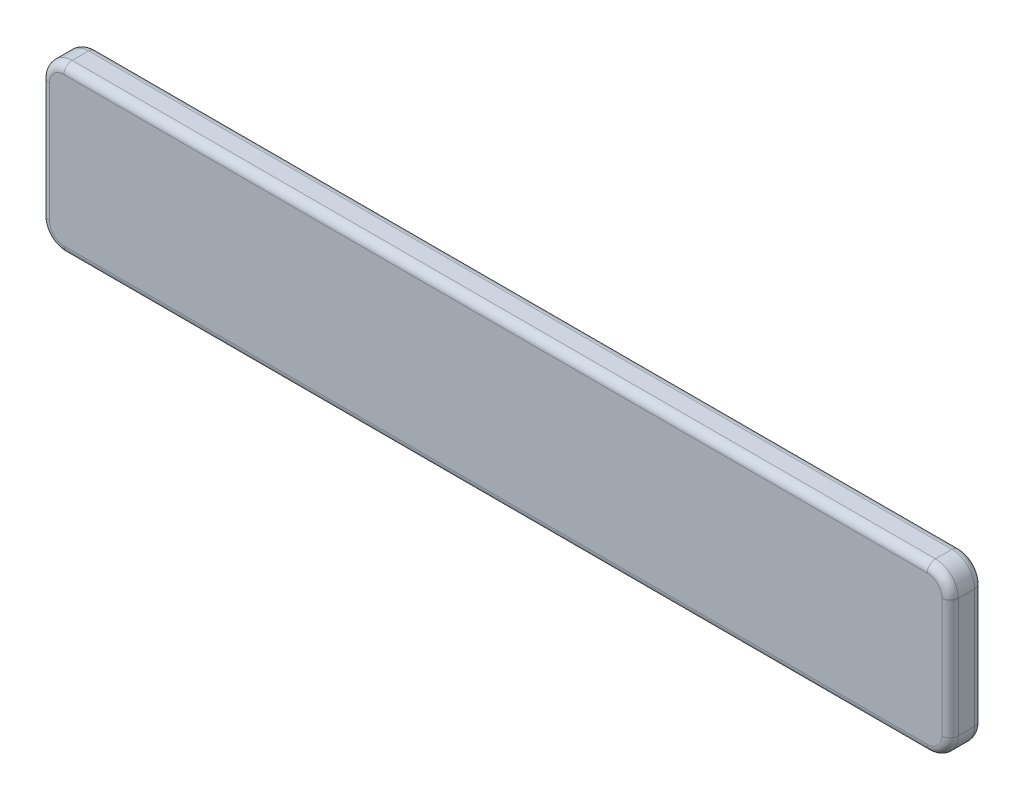
ISO-10303-21;
HEADER;
FILE_DESCRIPTION(('STEP AP214'),'2;1');
FILE_NAME('part.step','',(''),(''),'','','');
FILE_SCHEMA(('AUTOMOTIVE_DESIGN { 1 0 10303 214 1 1 1 1 }'));
ENDSEC;
DATA;
#1=APPLICATION_CONTEXT('core data for automotive mechanical design processes');
#2=APPLICATION_PROTOCOL_DEFINITION('international standard','automotive_design',2000,#1);
#3=PRODUCT_CONTEXT('',#1,'mechanical');
#4=PRODUCT('Part','Part','',(#3));
#5=PRODUCT_RELATED_PRODUCT_CATEGORY('part','',(#4));
#6=PRODUCT_DEFINITION_FORMATION('','',#4);
#7=PRODUCT_DEFINITION_CONTEXT('part definition',#1,'design');
#8=PRODUCT_DEFINITION('design','',#6,#7);
#9=PRODUCT_DEFINITION_SHAPE('','',#8);
#10=(LENGTH_UNIT() NAMED_UNIT(*) SI_UNIT(.MILLI.,.METRE.));
#11=(NAMED_UNIT(*) PLANE_ANGLE_UNIT() SI_UNIT($,.RADIAN.));
#12=(NAMED_UNIT(*) SI_UNIT($,.STERADIAN.) SOLID_ANGLE_UNIT());
#13=UNCERTAINTY_MEASURE_WITH_UNIT(LENGTH_MEASURE(1.E-05),#10,'distance_accuracy_value','');
#14=(GEOMETRIC_REPRESENTATION_CONTEXT(3) GLOBAL_UNCERTAINTY_ASSIGNED_CONTEXT((#13)) GLOBAL_UNIT_ASSIGNED_CONTEXT((#10,
#11,#12)) REPRESENTATION_CONTEXT('',''));
#15=CARTESIAN_POINT('',(0.,0.,0.));
#16=DIRECTION('',(0.,0.,1.));
#17=DIRECTION('',(1.,0.,0.));
#18=AXIS2_PLACEMENT_3D('',#15,#16,#17);
#19=CARTESIAN_POINT('',(167.513,-48.7426,12.7));
#20=DIRECTION('',(0.,0.,-1.));
#21=DIRECTION('',(-1.,0.,0.));
#22=AXIS2_PLACEMENT_3D('',#19,#20,#21);
#23=CYLINDRICAL_SURFACE('',#22,8.8392);
#24=DIRECTION('',(0.,0.,-1.));
#25=VECTOR('',#24,1.);
#26=CARTESIAN_POINT('',(167.513,-57.5818,12.7));
#27=LINE('',#26,#25);
#28=CARTESIAN_POINT('',(167.513,-57.5818,9.525));
#29=VERTEX_POINT('',#28);
#30=CARTESIAN_POINT('',(167.513,-57.5818,3.175));
#31=VERTEX_POINT('',#30);
#32=EDGE_CURVE('E174',#29,#31,#27,.T.);
#33=ORIENTED_EDGE('',*,*,#32,.T.);
#34=CARTESIAN_POINT('',(167.513,-48.7426,3.175));
#35=DIRECTION('',(0.,0.,1.));
#36=DIRECTION('',(1.,0.,0.));
#37=AXIS2_PLACEMENT_3D('',#34,#35,#36);
#38=CIRCLE('',#37,8.8392);
#39=CARTESIAN_POINT('',(176.3522,-48.7426,3.175));
#40=VERTEX_POINT('',#39);
#41=EDGE_CURVE('E250',#31,#40,#38,.T.);
#42=ORIENTED_EDGE('',*,*,#41,.T.);
#43=DIRECTION('',(0.,0.,-1.));
#44=VECTOR('',#43,1.);
#45=CARTESIAN_POINT('',(176.3522,-48.7426,12.7));
#46=LINE('',#45,#44);
#47=CARTESIAN_POINT('',(176.3522,-48.7426,9.525));
#48=VERTEX_POINT('',#47);
#49=EDGE_CURVE('E177',#48,#40,#46,.T.);
#50=ORIENTED_EDGE('',*,*,#49,.F.);
#51=CARTESIAN_POINT('',(167.513,-48.7426,9.525));
#52=DIRECTION('',(0.,0.,1.));
#53=DIRECTION('',(1.,0.,0.));
#54=AXIS2_PLACEMENT_3D('',#51,#52,#53);
#55=CIRCLE('',#54,8.8392);
#56=EDGE_CURVE('E201',#48,#29,#55,.F.);
#57=ORIENTED_EDGE('',*,*,#56,.T.);
#58=EDGE_LOOP('',(#33,#42,#50,#57));
#59=FACE_BOUND('',#58,.T.);
#60=ADVANCED_FACE('F33',(#59),#23,.T.);
#61=CARTESIAN_POINT('',(176.3522,-2.48920000000002,12.7));
#62=DIRECTION('',(1.,0.,0.));
#63=DIRECTION('',(0.,1.,0.));
#64=AXIS2_PLACEMENT_3D('',#61,#62,#63);
#65=PLANE('',#64);
#66=ORIENTED_EDGE('',*,*,#49,.T.);
#67=DIRECTION('',(0.,-1.,0.));
#68=VECTOR('',#67,1.);
#69=CARTESIAN_POINT('',(176.3522,-2.48920000000002,3.175));
#70=LINE('',#69,#68);
#71=CARTESIAN_POINT('',(176.3522,-2.48920000000002,3.175));
#72=VERTEX_POINT('',#71);
#73=EDGE_CURVE('E57',#40,#72,#70,.F.);
#74=ORIENTED_EDGE('',*,*,#73,.T.);
#75=DIRECTION('',(0.,0.,-1.));
#76=VECTOR('',#75,1.);
#77=CARTESIAN_POINT('',(176.3522,-2.48920000000002,12.7));
#78=LINE('',#77,#76);
#79=CARTESIAN_POINT('',(176.3522,-2.48920000000002,9.525));
#80=VERTEX_POINT('',#79);
#81=EDGE_CURVE('E310',#80,#72,#78,.T.);
#82=ORIENTED_EDGE('',*,*,#81,.F.);
#83=DIRECTION('',(0.,-1.,0.));
#84=VECTOR('',#83,1.);
#85=CARTESIAN_POINT('',(176.3522,-2.48920000000002,9.525));
#86=LINE('',#85,#84);
#87=EDGE_CURVE('E203',#80,#48,#86,.T.);
#88=ORIENTED_EDGE('',*,*,#87,.T.);
#89=EDGE_LOOP('',(#66,#74,#82,#88));
#90=FACE_BOUND('',#89,.T.);
#91=ADVANCED_FACE('F317',(#90),#65,.T.);
#92=CARTESIAN_POINT('',(167.513,-2.48920000000008,12.7));
#93=DIRECTION('',(0.,0.,-1.));
#94=DIRECTION('',(-1.,0.,0.));
#95=AXIS2_PLACEMENT_3D('',#92,#93,#94);
#96=CYLINDRICAL_SURFACE('',#95,8.83920000000001);
#97=ORIENTED_EDGE('',*,*,#81,.T.);
#98=CARTESIAN_POINT('',(167.513,-2.48920000000008,3.175));
#99=DIRECTION('',(0.,0.,1.));
#100=DIRECTION('',(1.,0.,0.));
#101=AXIS2_PLACEMENT_3D('',#98,#99,#100);
#102=CIRCLE('',#101,8.83920000000001);
#103=CARTESIAN_POINT('',(167.513,6.34999999999993,3.175));
#104=VERTEX_POINT('',#103);
#105=EDGE_CURVE('E42',#72,#104,#102,.T.);
#106=ORIENTED_EDGE('',*,*,#105,.T.);
#107=DIRECTION('',(0.,0.,-1.));
#108=VECTOR('',#107,1.);
#109=CARTESIAN_POINT('',(167.513,6.34999999999993,12.7));
#110=LINE('',#109,#108);
#111=CARTESIAN_POINT('',(167.513,6.34999999999993,9.525));
#112=VERTEX_POINT('',#111);
#113=EDGE_CURVE('E302',#112,#104,#110,.T.);
#114=ORIENTED_EDGE('',*,*,#113,.F.);
#115=CARTESIAN_POINT('',(167.513,-2.48920000000008,9.525));
#116=DIRECTION('',(0.,0.,1.));
#117=DIRECTION('',(1.,0.,0.));
#118=AXIS2_PLACEMENT_3D('',#115,#116,#117);
#119=CIRCLE('',#118,8.83920000000001);
#120=EDGE_CURVE('E165',#112,#80,#119,.F.);
#121=ORIENTED_EDGE('',*,*,#120,.T.);
#122=EDGE_LOOP('',(#97,#106,#114,#121));
#123=FACE_BOUND('',#122,.T.);
#124=ADVANCED_FACE('F345',(#123),#96,.T.);
#125=CARTESIAN_POINT('',(-167.513,6.35,12.7));
#126=DIRECTION('',(0.,1.,0.));
#127=DIRECTION('',(-1.,0.,0.));
#128=AXIS2_PLACEMENT_3D('',#125,#126,#127);
#129=PLANE('',#128);
#130=ORIENTED_EDGE('',*,*,#113,.T.);
#131=DIRECTION('',(1.,0.,0.));
#132=VECTOR('',#131,1.);
#133=CARTESIAN_POINT('',(-167.513,6.35,3.175));
#134=LINE('',#133,#132);
#135=CARTESIAN_POINT('',(-167.513,6.34999999999999,3.175));
#136=VERTEX_POINT('',#135);
#137=EDGE_CURVE('E11',#104,#136,#134,.F.);
#138=ORIENTED_EDGE('',*,*,#137,.T.);
#139=DIRECTION('',(0.,0.,-1.));
#140=VECTOR('',#139,1.);
#141=CARTESIAN_POINT('',(-167.513,6.34999999999999,12.7));
#142=LINE('',#141,#140);
#143=CARTESIAN_POINT('',(-167.513,6.34999999999999,9.525));
#144=VERTEX_POINT('',#143);
#145=EDGE_CURVE('E301',#144,#136,#142,.T.);
#146=ORIENTED_EDGE('',*,*,#145,.F.);
#147=DIRECTION('',(1.,0.,0.));
#148=VECTOR('',#147,1.);
#149=CARTESIAN_POINT('',(-167.513,6.35,9.525));
#150=LINE('',#149,#148);
#151=EDGE_CURVE('E206',#144,#112,#150,.T.);
#152=ORIENTED_EDGE('',*,*,#151,.T.);
#153=EDGE_LOOP('',(#130,#138,#146,#152));
#154=FACE_BOUND('',#153,.T.);
#155=ADVANCED_FACE('F300',(#154),#129,.T.);
#156=CARTESIAN_POINT('',(-167.513,-2.48919999999998,12.7));
#157=DIRECTION('',(0.,0.,-1.));
#158=DIRECTION('',(-1.,0.,0.));
#159=AXIS2_PLACEMENT_3D('',#156,#157,#158);
#160=CYLINDRICAL_SURFACE('',#159,8.83919999999997);
#161=ORIENTED_EDGE('',*,*,#145,.T.);
#162=CARTESIAN_POINT('',(-167.513,-2.48919999999998,3.175));
#163=DIRECTION('',(0.,0.,1.));
#164=DIRECTION('',(1.,0.,0.));
#165=AXIS2_PLACEMENT_3D('',#162,#163,#164);
#166=CIRCLE('',#165,8.83919999999997);
#167=CARTESIAN_POINT('',(-176.3522,-2.48919999999995,3.175));
#168=VERTEX_POINT('',#167);
#169=EDGE_CURVE('E208',#136,#168,#166,.T.);
#170=ORIENTED_EDGE('',*,*,#169,.T.);
#171=DIRECTION('',(0.,0.,-1.));
#172=VECTOR('',#171,1.);
#173=CARTESIAN_POINT('',(-176.3522,-2.48919999999995,12.7));
#174=LINE('',#173,#172);
#175=CARTESIAN_POINT('',(-176.3522,-2.48919999999995,9.525));
#176=VERTEX_POINT('',#175);
#177=EDGE_CURVE('E308',#176,#168,#174,.T.);
#178=ORIENTED_EDGE('',*,*,#177,.F.);
#179=CARTESIAN_POINT('',(-167.513,-2.48919999999998,9.525));
#180=DIRECTION('',(0.,0.,1.));
#181=DIRECTION('',(1.,0.,0.));
#182=AXIS2_PLACEMENT_3D('',#179,#180,#181);
#183=CIRCLE('',#182,8.83919999999997);
#184=EDGE_CURVE('E192',#176,#144,#183,.F.);
#185=ORIENTED_EDGE('',*,*,#184,.T.);
#186=EDGE_LOOP('',(#161,#170,#178,#185));
#187=FACE_BOUND('',#186,.T.);
#188=ADVANCED_FACE('F304',(#187),#160,.T.);
#189=CARTESIAN_POINT('',(-176.3522,-48.7426,12.7));
#190=DIRECTION('',(-1.,0.,0.));
#191=DIRECTION('',(0.,-1.,0.));
#192=AXIS2_PLACEMENT_3D('',#189,#190,#191);
#193=PLANE('',#192);
#194=ORIENTED_EDGE('',*,*,#177,.T.);
#195=DIRECTION('',(0.,1.,0.));
#196=VECTOR('',#195,1.);
#197=CARTESIAN_POINT('',(-176.3522,-48.7426,3.175));
#198=LINE('',#197,#196);
#199=CARTESIAN_POINT('',(-176.3522,-48.7426,3.175));
#200=VERTEX_POINT('',#199);
#201=EDGE_CURVE('E244',#168,#200,#198,.F.);
#202=ORIENTED_EDGE('',*,*,#201,.T.);
#203=DIRECTION('',(0.,0.,-1.));
#204=VECTOR('',#203,1.);
#205=CARTESIAN_POINT('',(-176.3522,-48.7426,12.7));
#206=LINE('',#205,#204);
#207=CARTESIAN_POINT('',(-176.3522,-48.7426,9.525));
#208=VERTEX_POINT('',#207);
#209=EDGE_CURVE('E312',#208,#200,#206,.T.);
#210=ORIENTED_EDGE('',*,*,#209,.F.);
#211=DIRECTION('',(0.,1.,0.));
#212=VECTOR('',#211,1.);
#213=CARTESIAN_POINT('',(-176.3522,-48.7426,9.525));
#214=LINE('',#213,#212);
#215=EDGE_CURVE('E195',#208,#176,#214,.T.);
#216=ORIENTED_EDGE('',*,*,#215,.T.);
#217=EDGE_LOOP('',(#194,#202,#210,#216));
#218=FACE_BOUND('',#217,.T.);
#219=ADVANCED_FACE('F512',(#218),#193,.T.);
#220=CARTESIAN_POINT('',(-167.513,-48.7426,12.7));
#221=DIRECTION('',(0.,0.,-1.));
#222=DIRECTION('',(-1.,0.,0.));
#223=AXIS2_PLACEMENT_3D('',#220,#221,#222);
#224=CYLINDRICAL_SURFACE('',#223,8.83919999999998);
#225=ORIENTED_EDGE('',*,*,#209,.T.);
#226=CARTESIAN_POINT('',(-167.513,-48.7426,3.175));
#227=DIRECTION('',(0.,0.,1.));
#228=DIRECTION('',(1.,0.,0.));
#229=AXIS2_PLACEMENT_3D('',#226,#227,#228);
#230=CIRCLE('',#229,8.83919999999998);
#231=CARTESIAN_POINT('',(-167.513,-57.5818,3.175));
#232=VERTEX_POINT('',#231);
#233=EDGE_CURVE('E246',#200,#232,#230,.T.);
#234=ORIENTED_EDGE('',*,*,#233,.T.);
#235=DIRECTION('',(0.,0.,-1.));
#236=VECTOR('',#235,1.);
#237=CARTESIAN_POINT('',(-167.513,-57.5818,12.7));
#238=LINE('',#237,#236);
#239=CARTESIAN_POINT('',(-167.513,-57.5818,9.525));
#240=VERTEX_POINT('',#239);
#241=EDGE_CURVE('E224',#240,#232,#238,.T.);
#242=ORIENTED_EDGE('',*,*,#241,.F.);
#243=CARTESIAN_POINT('',(-167.513,-48.7426,9.525));
#244=DIRECTION('',(0.,0.,1.));
#245=DIRECTION('',(1.,0.,0.));
#246=AXIS2_PLACEMENT_3D('',#243,#244,#245);
#247=CIRCLE('',#246,8.83919999999998);
#248=EDGE_CURVE('E197',#240,#208,#247,.F.);
#249=ORIENTED_EDGE('',*,*,#248,.T.);
#250=EDGE_LOOP('',(#225,#234,#242,#249));
#251=FACE_BOUND('',#250,.T.);
#252=ADVANCED_FACE('F499',(#251),#224,.T.);
#253=CARTESIAN_POINT('',(-157.3022,-57.5818000000001,12.7));
#254=DIRECTION('',(0.,-1.,0.));
#255=DIRECTION('',(1.,0.,0.));
#256=AXIS2_PLACEMENT_3D('',#253,#254,#255);
#257=PLANE('',#256);
#258=ORIENTED_EDGE('',*,*,#241,.T.);
#259=DIRECTION('',(-1.,0.,0.));
#260=VECTOR('',#259,1.);
#261=CARTESIAN_POINT('',(167.513,-57.5818000000027,3.175));
#262=LINE('',#261,#260);
#263=EDGE_CURVE('E248',#232,#31,#262,.F.);
#264=ORIENTED_EDGE('',*,*,#263,.T.);
#265=ORIENTED_EDGE('',*,*,#32,.F.);
#266=DIRECTION('',(1.,0.,0.));
#267=VECTOR('',#266,1.);
#268=CARTESIAN_POINT('',(-157.3022,-57.5818000000001,9.525));
#269=LINE('',#268,#267);
#270=EDGE_CURVE('E199',#29,#240,#269,.F.);
#271=ORIENTED_EDGE('',*,*,#270,.T.);
#272=EDGE_LOOP('',(#258,#264,#265,#271));
#273=FACE_BOUND('',#272,.T.);
#274=ADVANCED_FACE('F492',(#273),#257,.T.);
#275=CARTESIAN_POINT('',(167.513,-48.7426,12.7));
#276=DIRECTION('',(0.,0.,1.));
#277=DIRECTION('',(1.,0.,0.));
#278=AXIS2_PLACEMENT_3D('',#275,#276,#277);
#279=PLANE('',#278);
#280=DIRECTION('',(1.,0.,0.));
#281=VECTOR('',#280,1.);
#282=CARTESIAN_POINT('',(167.513,3.17499999999993,12.7));
#283=LINE('',#282,#281);
#284=CARTESIAN_POINT('',(167.513,3.17499999999993,12.7));
#285=VERTEX_POINT('',#284);
#286=CARTESIAN_POINT('',(-167.513,3.175,12.7));
#287=VERTEX_POINT('',#286);
#288=EDGE_CURVE('E153',#285,#287,#283,.F.);
#289=ORIENTED_EDGE('',*,*,#288,.T.);
#290=CARTESIAN_POINT('',(-167.513,-2.48919999999998,12.7));
#291=DIRECTION('',(0.,0.,1.));
#292=DIRECTION('',(1.,0.,0.));
#293=AXIS2_PLACEMENT_3D('',#290,#291,#292);
#294=CIRCLE('',#293,5.66419999999997);
#295=CARTESIAN_POINT('',(-173.1772,-2.48919999999996,12.7));
#296=VERTEX_POINT('',#295);
#297=EDGE_CURVE('E190',#287,#296,#294,.T.);
#298=ORIENTED_EDGE('',*,*,#297,.T.);
#299=DIRECTION('',(0.,1.,0.));
#300=VECTOR('',#299,1.);
#301=CARTESIAN_POINT('',(-173.1772,-48.7425999999988,12.7));
#302=LINE('',#301,#300);
#303=CARTESIAN_POINT('',(-173.1772,-48.7426,12.7));
#304=VERTEX_POINT('',#303);
#305=EDGE_CURVE('E188',#296,#304,#302,.F.);
#306=ORIENTED_EDGE('',*,*,#305,.T.);
#307=CARTESIAN_POINT('',(-167.513,-48.7426,12.7));
#308=DIRECTION('',(0.,0.,1.));
#309=DIRECTION('',(1.,0.,0.));
#310=AXIS2_PLACEMENT_3D('',#307,#308,#309);
#311=CIRCLE('',#310,5.66419999999998);
#312=CARTESIAN_POINT('',(-167.513,-54.4068,12.7));
#313=VERTEX_POINT('',#312);
#314=EDGE_CURVE('E186',#304,#313,#311,.T.);
#315=ORIENTED_EDGE('',*,*,#314,.T.);
#316=DIRECTION('',(1.,0.,0.));
#317=VECTOR('',#316,1.);
#318=CARTESIAN_POINT('',(167.513,-54.4068000000027,12.7));
#319=LINE('',#318,#317);
#320=CARTESIAN_POINT('',(167.513,-54.4068,12.7));
#321=VERTEX_POINT('',#320);
#322=EDGE_CURVE('E184',#313,#321,#319,.T.);
#323=ORIENTED_EDGE('',*,*,#322,.T.);
#324=CARTESIAN_POINT('',(167.513,-48.7426,12.7));
#325=DIRECTION('',(0.,0.,1.));
#326=DIRECTION('',(1.,0.,0.));
#327=AXIS2_PLACEMENT_3D('',#324,#325,#326);
#328=CIRCLE('',#327,5.6642);
#329=CARTESIAN_POINT('',(173.1772,-48.7426,12.7));
#330=VERTEX_POINT('',#329);
#331=EDGE_CURVE('E182',#321,#330,#328,.T.);
#332=ORIENTED_EDGE('',*,*,#331,.T.);
#333=DIRECTION('',(0.,-1.,0.));
#334=VECTOR('',#333,1.);
#335=CARTESIAN_POINT('',(173.1772,-48.7426,12.7));
#336=LINE('',#335,#334);
#337=CARTESIAN_POINT('',(173.1772,-2.48920000000003,12.7));
#338=VERTEX_POINT('',#337);
#339=EDGE_CURVE('E156',#330,#338,#336,.F.);
#340=ORIENTED_EDGE('',*,*,#339,.T.);
#341=CARTESIAN_POINT('',(167.513,-2.48920000000008,12.7));
#342=DIRECTION('',(0.,0.,1.));
#343=DIRECTION('',(1.,0.,0.));
#344=AXIS2_PLACEMENT_3D('',#341,#342,#343);
#345=CIRCLE('',#344,5.66420000000001);
#346=EDGE_CURVE('E148',#338,#285,#345,.T.);
#347=ORIENTED_EDGE('',*,*,#346,.T.);
#348=EDGE_LOOP('',(#289,#298,#306,#315,#323,#332,#340,#347));
#349=FACE_BOUND('',#348,.T.);
#350=ADVANCED_FACE('F150',(#349),#279,.T.);
#351=CARTESIAN_POINT('',(167.513,-48.7426,0.));
#352=DIRECTION('',(0.,0.,1.));
#353=DIRECTION('',(1.,0.,0.));
#354=AXIS2_PLACEMENT_3D('',#351,#352,#353);
#355=PLANE('',#354);
#356=DIRECTION('',(0.,1.,0.));
#357=VECTOR('',#356,1.);
#358=CARTESIAN_POINT('',(-173.1772,-2.48919999999996,0.));
#359=LINE('',#358,#357);
#360=CARTESIAN_POINT('',(-173.1772,-48.7426,0.));
#361=VERTEX_POINT('',#360);
#362=CARTESIAN_POINT('',(-173.1772,-2.48919999999996,0.));
#363=VERTEX_POINT('',#362);
#364=EDGE_CURVE('E239',#361,#363,#359,.T.);
#365=ORIENTED_EDGE('',*,*,#364,.T.);
#366=CARTESIAN_POINT('',(-167.513,-2.48919999999998,0.));
#367=DIRECTION('',(0.,0.,1.));
#368=DIRECTION('',(1.,0.,0.));
#369=AXIS2_PLACEMENT_3D('',#366,#367,#368);
#370=CIRCLE('',#369,5.66419999999997);
#371=CARTESIAN_POINT('',(-167.513,3.17499999999999,0.));
#372=VERTEX_POINT('',#371);
#373=EDGE_CURVE('E241',#363,#372,#370,.F.);
#374=ORIENTED_EDGE('',*,*,#373,.T.);
#375=DIRECTION('',(1.,0.,0.));
#376=VECTOR('',#375,1.);
#377=CARTESIAN_POINT('',(167.513,3.17499999999993,0.));
#378=LINE('',#377,#376);
#379=CARTESIAN_POINT('',(167.513,3.17499999999993,0.));
#380=VERTEX_POINT('',#379);
#381=EDGE_CURVE('E227',#372,#380,#378,.T.);
#382=ORIENTED_EDGE('',*,*,#381,.T.);
#383=CARTESIAN_POINT('',(167.513,-2.48920000000008,0.));
#384=DIRECTION('',(0.,0.,1.));
#385=DIRECTION('',(1.,0.,0.));
#386=AXIS2_PLACEMENT_3D('',#383,#384,#385);
#387=CIRCLE('',#386,5.66420000000001);
#388=CARTESIAN_POINT('',(173.1772,-2.48920000000003,0.));
#389=VERTEX_POINT('',#388);
#390=EDGE_CURVE('E229',#380,#389,#387,.F.);
#391=ORIENTED_EDGE('',*,*,#390,.T.);
#392=DIRECTION('',(0.,-1.,0.));
#393=VECTOR('',#392,1.);
#394=CARTESIAN_POINT('',(173.1772,-48.7426,0.));
#395=LINE('',#394,#393);
#396=CARTESIAN_POINT('',(173.1772,-48.7426,0.));
#397=VERTEX_POINT('',#396);
#398=EDGE_CURVE('E231',#389,#397,#395,.T.);
#399=ORIENTED_EDGE('',*,*,#398,.T.);
#400=CARTESIAN_POINT('',(167.513,-48.7426,0.));
#401=DIRECTION('',(0.,0.,1.));
#402=DIRECTION('',(1.,0.,0.));
#403=AXIS2_PLACEMENT_3D('',#400,#401,#402);
#404=CIRCLE('',#403,5.6642);
#405=CARTESIAN_POINT('',(167.513,-54.4068,0.));
#406=VERTEX_POINT('',#405);
#407=EDGE_CURVE('E233',#397,#406,#404,.F.);
#408=ORIENTED_EDGE('',*,*,#407,.T.);
#409=DIRECTION('',(-1.,0.,0.));
#410=VECTOR('',#409,1.);
#411=CARTESIAN_POINT('',(-167.513,-54.4068,0.));
#412=LINE('',#411,#410);
#413=CARTESIAN_POINT('',(-167.513,-54.4068,0.));
#414=VERTEX_POINT('',#413);
#415=EDGE_CURVE('E235',#406,#414,#412,.T.);
#416=ORIENTED_EDGE('',*,*,#415,.T.);
#417=CARTESIAN_POINT('',(-167.513,-48.7426,0.));
#418=DIRECTION('',(0.,0.,1.));
#419=DIRECTION('',(1.,0.,0.));
#420=AXIS2_PLACEMENT_3D('',#417,#418,#419);
#421=CIRCLE('',#420,5.66419999999998);
#422=EDGE_CURVE('E237',#414,#361,#421,.F.);
#423=ORIENTED_EDGE('',*,*,#422,.T.);
#424=EDGE_LOOP('',(#365,#374,#382,#391,#399,#408,#416,#423));
#425=FACE_BOUND('',#424,.T.);
#426=ADVANCED_FACE('F285',(#425),#355,.F.);
#427=CARTESIAN_POINT('',(167.513,-48.7426,9.525));
#428=DIRECTION('',(0.,0.,1.));
#429=DIRECTION('',(1.,0.,0.));
#430=AXIS2_PLACEMENT_3D('',#427,#428,#429);
#431=TOROIDAL_SURFACE('',#430,5.6642,3.175);
#432=CARTESIAN_POINT('',(167.513,-54.4068,9.525));
#433=DIRECTION('',(-1.,0.,0.));
#434=DIRECTION('',(0.,0.,1.));
#435=AXIS2_PLACEMENT_3D('',#432,#433,#434);
#436=CIRCLE('',#435,3.175);
#437=EDGE_CURVE('E218',#29,#321,#436,.T.);
#438=ORIENTED_EDGE('',*,*,#437,.F.);
#439=ORIENTED_EDGE('',*,*,#56,.F.);
#440=CARTESIAN_POINT('',(173.1772,-48.7426,9.525));
#441=DIRECTION('',(0.,1.,0.));
#442=DIRECTION('',(-1.,0.,0.));
#443=AXIS2_PLACEMENT_3D('',#440,#441,#442);
#444=CIRCLE('',#443,3.175);
#445=EDGE_CURVE('E221',#330,#48,#444,.T.);
#446=ORIENTED_EDGE('',*,*,#445,.F.);
#447=ORIENTED_EDGE('',*,*,#331,.F.);
#448=EDGE_LOOP('',(#438,#439,#446,#447));
#449=FACE_BOUND('',#448,.T.);
#450=ADVANCED_FACE('F325',(#449),#431,.T.);
#451=CARTESIAN_POINT('',(173.1772,-2.48920000000003,9.525));
#452=DIRECTION('',(0.,-1.,0.));
#453=DIRECTION('',(1.,0.,0.));
#454=AXIS2_PLACEMENT_3D('',#451,#452,#453);
#455=CYLINDRICAL_SURFACE('',#454,3.175);
#456=ORIENTED_EDGE('',*,*,#445,.T.);
#457=ORIENTED_EDGE('',*,*,#87,.F.);
#458=CARTESIAN_POINT('',(173.1772,-2.48920000000003,9.525));
#459=DIRECTION('',(0.,1.,0.));
#460=DIRECTION('',(-1.,0.,0.));
#461=AXIS2_PLACEMENT_3D('',#458,#459,#460);
#462=CIRCLE('',#461,3.175);
#463=EDGE_CURVE('E216',#338,#80,#462,.T.);
#464=ORIENTED_EDGE('',*,*,#463,.F.);
#465=ORIENTED_EDGE('',*,*,#339,.F.);
#466=EDGE_LOOP('',(#456,#457,#464,#465));
#467=FACE_BOUND('',#466,.T.);
#468=ADVANCED_FACE('F329',(#467),#455,.T.);
#469=CARTESIAN_POINT('',(167.513,-54.4068000000027,9.525));
#470=DIRECTION('',(1.,0.,0.));
#471=DIRECTION('',(0.,1.,0.));
#472=AXIS2_PLACEMENT_3D('',#469,#470,#471);
#473=CYLINDRICAL_SURFACE('',#472,3.175);
#474=ORIENTED_EDGE('',*,*,#437,.T.);
#475=ORIENTED_EDGE('',*,*,#322,.F.);
#476=CARTESIAN_POINT('',(-167.513,-54.4068,9.525));
#477=DIRECTION('',(-1.,0.,0.));
#478=DIRECTION('',(0.,-1.,0.));
#479=AXIS2_PLACEMENT_3D('',#476,#477,#478);
#480=CIRCLE('',#479,3.175);
#481=EDGE_CURVE('E168',#240,#313,#480,.T.);
#482=ORIENTED_EDGE('',*,*,#481,.F.);
#483=ORIENTED_EDGE('',*,*,#270,.F.);
#484=EDGE_LOOP('',(#474,#475,#482,#483));
#485=FACE_BOUND('',#484,.T.);
#486=ADVANCED_FACE('F331',(#485),#473,.T.);
#487=CARTESIAN_POINT('',(167.513,-2.48920000000008,9.525));
#488=DIRECTION('',(0.,0.,1.));
#489=DIRECTION('',(1.,0.,0.));
#490=AXIS2_PLACEMENT_3D('',#487,#488,#489);
#491=TOROIDAL_SURFACE('',#490,5.66420000000001,3.175);
#492=ORIENTED_EDGE('',*,*,#463,.T.);
#493=ORIENTED_EDGE('',*,*,#120,.F.);
#494=CARTESIAN_POINT('',(167.513,3.17499999999994,9.525));
#495=DIRECTION('',(-1.,0.,0.));
#496=DIRECTION('',(0.,0.,1.));
#497=AXIS2_PLACEMENT_3D('',#494,#495,#496);
#498=CIRCLE('',#497,3.175);
#499=EDGE_CURVE('E163',#285,#112,#498,.T.);
#500=ORIENTED_EDGE('',*,*,#499,.F.);
#501=ORIENTED_EDGE('',*,*,#346,.F.);
#502=EDGE_LOOP('',(#492,#493,#500,#501));
#503=FACE_BOUND('',#502,.T.);
#504=ADVANCED_FACE('F164',(#503),#491,.T.);
#505=CARTESIAN_POINT('',(-167.513,-48.7426,9.525));
#506=DIRECTION('',(0.,0.,1.));
#507=DIRECTION('',(1.,0.,0.));
#508=AXIS2_PLACEMENT_3D('',#505,#506,#507);
#509=TOROIDAL_SURFACE('',#508,5.66419999999998,3.175);
#510=ORIENTED_EDGE('',*,*,#481,.T.);
#511=ORIENTED_EDGE('',*,*,#314,.F.);
#512=CARTESIAN_POINT('',(-173.1772,-48.7426,9.525));
#513=DIRECTION('',(0.,1.,0.));
#514=DIRECTION('',(0.,0.,1.));
#515=AXIS2_PLACEMENT_3D('',#512,#513,#514);
#516=CIRCLE('',#515,3.175);
#517=EDGE_CURVE('E169',#208,#304,#516,.T.);
#518=ORIENTED_EDGE('',*,*,#517,.F.);
#519=ORIENTED_EDGE('',*,*,#248,.F.);
#520=EDGE_LOOP('',(#510,#511,#518,#519));
#521=FACE_BOUND('',#520,.T.);
#522=ADVANCED_FACE('F359',(#521),#509,.T.);
#523=CARTESIAN_POINT('',(-167.513,3.175,9.525));
#524=DIRECTION('',(1.,0.,0.));
#525=DIRECTION('',(0.,1.,0.));
#526=AXIS2_PLACEMENT_3D('',#523,#524,#525);
#527=CYLINDRICAL_SURFACE('',#526,3.175);
#528=ORIENTED_EDGE('',*,*,#499,.T.);
#529=ORIENTED_EDGE('',*,*,#151,.F.);
#530=CARTESIAN_POINT('',(-167.513,3.175,9.525));
#531=DIRECTION('',(-1.,0.,0.));
#532=DIRECTION('',(0.,0.,1.));
#533=AXIS2_PLACEMENT_3D('',#530,#531,#532);
#534=CIRCLE('',#533,3.175);
#535=EDGE_CURVE('E172',#287,#144,#534,.T.);
#536=ORIENTED_EDGE('',*,*,#535,.F.);
#537=ORIENTED_EDGE('',*,*,#288,.F.);
#538=EDGE_LOOP('',(#528,#529,#536,#537));
#539=FACE_BOUND('',#538,.T.);
#540=ADVANCED_FACE('F171',(#539),#527,.T.);
#541=CARTESIAN_POINT('',(-173.1772,-48.7426,9.525));
#542=DIRECTION('',(0.,1.,0.));
#543=DIRECTION('',(-1.,0.,0.));
#544=AXIS2_PLACEMENT_3D('',#541,#542,#543);
#545=CYLINDRICAL_SURFACE('',#544,3.175);
#546=ORIENTED_EDGE('',*,*,#517,.T.);
#547=ORIENTED_EDGE('',*,*,#305,.F.);
#548=CARTESIAN_POINT('',(-173.1772,-2.48919999999996,9.525));
#549=DIRECTION('',(0.,1.,0.));
#550=DIRECTION('',(-1.,0.,0.));
#551=AXIS2_PLACEMENT_3D('',#548,#549,#550);
#552=CIRCLE('',#551,3.175);
#553=EDGE_CURVE('E209',#176,#296,#552,.T.);
#554=ORIENTED_EDGE('',*,*,#553,.F.);
#555=ORIENTED_EDGE('',*,*,#215,.F.);
#556=EDGE_LOOP('',(#546,#547,#554,#555));
#557=FACE_BOUND('',#556,.T.);
#558=ADVANCED_FACE('F352',(#557),#545,.T.);
#559=CARTESIAN_POINT('',(-167.513,-2.48919999999998,9.525));
#560=DIRECTION('',(0.,0.,1.));
#561=DIRECTION('',(1.,0.,0.));
#562=AXIS2_PLACEMENT_3D('',#559,#560,#561);
#563=TOROIDAL_SURFACE('',#562,5.66419999999997,3.175);
#564=ORIENTED_EDGE('',*,*,#535,.T.);
#565=ORIENTED_EDGE('',*,*,#184,.F.);
#566=ORIENTED_EDGE('',*,*,#553,.T.);
#567=ORIENTED_EDGE('',*,*,#297,.F.);
#568=EDGE_LOOP('',(#564,#565,#566,#567));
#569=FACE_BOUND('',#568,.T.);
#570=ADVANCED_FACE('F349',(#569),#563,.T.);
#571=CARTESIAN_POINT('',(167.513,-48.7426,3.175));
#572=DIRECTION('',(0.,0.,1.));
#573=DIRECTION('',(1.,0.,0.));
#574=AXIS2_PLACEMENT_3D('',#571,#572,#573);
#575=TOROIDAL_SURFACE('',#574,5.6642,3.175);
#576=CARTESIAN_POINT('',(167.513,-54.4068,3.175));
#577=DIRECTION('',(-1.,0.,0.));
#578=DIRECTION('',(0.,-1.,0.));
#579=AXIS2_PLACEMENT_3D('',#576,#577,#578);
#580=CIRCLE('',#579,3.175);
#581=EDGE_CURVE('E269',#406,#31,#580,.T.);
#582=ORIENTED_EDGE('',*,*,#581,.F.);
#583=ORIENTED_EDGE('',*,*,#407,.F.);
#584=CARTESIAN_POINT('',(173.1772,-48.7426,3.175));
#585=DIRECTION('',(0.,1.,0.));
#586=DIRECTION('',(-1.,0.,0.));
#587=AXIS2_PLACEMENT_3D('',#584,#585,#586);
#588=CIRCLE('',#587,3.175);
#589=EDGE_CURVE('E37',#40,#397,#588,.T.);
#590=ORIENTED_EDGE('',*,*,#589,.F.);
#591=ORIENTED_EDGE('',*,*,#41,.F.);
#592=EDGE_LOOP('',(#582,#583,#590,#591));
#593=FACE_BOUND('',#592,.T.);
#594=ADVANCED_FACE('F35',(#593),#575,.T.);
#595=CARTESIAN_POINT('',(173.1772,-48.7426,3.175));
#596=DIRECTION('',(0.,1.,0.));
#597=DIRECTION('',(-1.,0.,0.));
#598=AXIS2_PLACEMENT_3D('',#595,#596,#597);
#599=CYLINDRICAL_SURFACE('',#598,3.175);
#600=ORIENTED_EDGE('',*,*,#589,.T.);
#601=ORIENTED_EDGE('',*,*,#398,.F.);
#602=CARTESIAN_POINT('',(173.1772,-2.48920000000003,3.175));
#603=DIRECTION('',(0.,1.,0.));
#604=DIRECTION('',(-1.,0.,0.));
#605=AXIS2_PLACEMENT_3D('',#602,#603,#604);
#606=CIRCLE('',#605,3.175);
#607=EDGE_CURVE('E267',#72,#389,#606,.T.);
#608=ORIENTED_EDGE('',*,*,#607,.F.);
#609=ORIENTED_EDGE('',*,*,#73,.F.);
#610=EDGE_LOOP('',(#600,#601,#608,#609));
#611=FACE_BOUND('',#610,.T.);
#612=ADVANCED_FACE('F279',(#611),#599,.T.);
#613=CARTESIAN_POINT('',(167.513,-54.4068000000027,3.175));
#614=DIRECTION('',(1.,0.,0.));
#615=DIRECTION('',(0.,1.,0.));
#616=AXIS2_PLACEMENT_3D('',#613,#614,#615);
#617=CYLINDRICAL_SURFACE('',#616,3.175);
#618=ORIENTED_EDGE('',*,*,#581,.T.);
#619=ORIENTED_EDGE('',*,*,#263,.F.);
#620=CARTESIAN_POINT('',(-167.513,-54.4068,3.175));
#621=DIRECTION('',(-1.,0.,0.));
#622=DIRECTION('',(0.,0.,1.));
#623=AXIS2_PLACEMENT_3D('',#620,#621,#622);
#624=CIRCLE('',#623,3.175);
#625=EDGE_CURVE('E264',#414,#232,#624,.T.);
#626=ORIENTED_EDGE('',*,*,#625,.F.);
#627=ORIENTED_EDGE('',*,*,#415,.F.);
#628=EDGE_LOOP('',(#618,#619,#626,#627));
#629=FACE_BOUND('',#628,.T.);
#630=ADVANCED_FACE('F396',(#629),#617,.T.);
#631=CARTESIAN_POINT('',(167.513,-2.48920000000008,3.175));
#632=DIRECTION('',(0.,0.,1.));
#633=DIRECTION('',(1.,0.,0.));
#634=AXIS2_PLACEMENT_3D('',#631,#632,#633);
#635=TOROIDAL_SURFACE('',#634,5.66420000000001,3.175);
#636=ORIENTED_EDGE('',*,*,#607,.T.);
#637=ORIENTED_EDGE('',*,*,#390,.F.);
#638=CARTESIAN_POINT('',(167.513,3.17499999999994,3.175));
#639=DIRECTION('',(-1.,0.,0.));
#640=DIRECTION('',(0.,0.,1.));
#641=AXIS2_PLACEMENT_3D('',#638,#639,#640);
#642=CIRCLE('',#641,3.175);
#643=EDGE_CURVE('E261',#104,#380,#642,.T.);
#644=ORIENTED_EDGE('',*,*,#643,.F.);
#645=ORIENTED_EDGE('',*,*,#105,.F.);
#646=EDGE_LOOP('',(#636,#637,#644,#645));
#647=FACE_BOUND('',#646,.T.);
#648=ADVANCED_FACE('F291',(#647),#635,.T.);
#649=CARTESIAN_POINT('',(-167.513,-48.7426,3.175));
#650=DIRECTION('',(0.,0.,1.));
#651=DIRECTION('',(1.,0.,0.));
#652=AXIS2_PLACEMENT_3D('',#649,#650,#651);
#653=TOROIDAL_SURFACE('',#652,5.66419999999998,3.175);
#654=ORIENTED_EDGE('',*,*,#625,.T.);
#655=ORIENTED_EDGE('',*,*,#233,.F.);
#656=CARTESIAN_POINT('',(-173.1772,-48.7426,3.175));
#657=DIRECTION('',(0.,1.,0.));
#658=DIRECTION('',(-1.,0.,0.));
#659=AXIS2_PLACEMENT_3D('',#656,#657,#658);
#660=CIRCLE('',#659,3.175);
#661=EDGE_CURVE('E258',#361,#200,#660,.T.);
#662=ORIENTED_EDGE('',*,*,#661,.F.);
#663=ORIENTED_EDGE('',*,*,#422,.F.);
#664=EDGE_LOOP('',(#654,#655,#662,#663));
#665=FACE_BOUND('',#664,.T.);
#666=ADVANCED_FACE('F408',(#665),#653,.T.);
#667=CARTESIAN_POINT('',(167.513,3.17499999999993,3.175));
#668=DIRECTION('',(-1.,0.,0.));
#669=DIRECTION('',(0.,-1.,0.));
#670=AXIS2_PLACEMENT_3D('',#667,#668,#669);
#671=CYLINDRICAL_SURFACE('',#670,3.175);
#672=ORIENTED_EDGE('',*,*,#643,.T.);
#673=ORIENTED_EDGE('',*,*,#381,.F.);
#674=CARTESIAN_POINT('',(-167.513,3.175,3.175));
#675=DIRECTION('',(-1.,0.,0.));
#676=DIRECTION('',(0.,0.,1.));
#677=AXIS2_PLACEMENT_3D('',#674,#675,#676);
#678=CIRCLE('',#677,3.175);
#679=EDGE_CURVE('E256',#136,#372,#678,.T.);
#680=ORIENTED_EDGE('',*,*,#679,.F.);
#681=ORIENTED_EDGE('',*,*,#137,.F.);
#682=EDGE_LOOP('',(#672,#673,#680,#681));
#683=FACE_BOUND('',#682,.T.);
#684=ADVANCED_FACE('F294',(#683),#671,.T.);
#685=CARTESIAN_POINT('',(-173.1772,-48.7425999999988,3.175));
#686=DIRECTION('',(0.,-1.,0.));
#687=DIRECTION('',(1.,0.,0.));
#688=AXIS2_PLACEMENT_3D('',#685,#686,#687);
#689=CYLINDRICAL_SURFACE('',#688,3.175);
#690=ORIENTED_EDGE('',*,*,#661,.T.);
#691=ORIENTED_EDGE('',*,*,#201,.F.);
#692=CARTESIAN_POINT('',(-173.1772,-2.48919999999996,3.175));
#693=DIRECTION('',(0.,1.,0.));
#694=DIRECTION('',(-1.,0.,0.));
#695=AXIS2_PLACEMENT_3D('',#692,#693,#694);
#696=CIRCLE('',#695,3.175);
#697=EDGE_CURVE('E254',#363,#168,#696,.T.);
#698=ORIENTED_EDGE('',*,*,#697,.F.);
#699=ORIENTED_EDGE('',*,*,#364,.F.);
#700=EDGE_LOOP('',(#690,#691,#698,#699));
#701=FACE_BOUND('',#700,.T.);
#702=ADVANCED_FACE('F422',(#701),#689,.T.);
#703=CARTESIAN_POINT('',(-167.513,-2.48919999999998,3.175));
#704=DIRECTION('',(0.,0.,1.));
#705=DIRECTION('',(1.,0.,0.));
#706=AXIS2_PLACEMENT_3D('',#703,#704,#705);
#707=TOROIDAL_SURFACE('',#706,5.66419999999997,3.175);
#708=ORIENTED_EDGE('',*,*,#679,.T.);
#709=ORIENTED_EDGE('',*,*,#373,.F.);
#710=ORIENTED_EDGE('',*,*,#697,.T.);
#711=ORIENTED_EDGE('',*,*,#169,.F.);
#712=EDGE_LOOP('',(#708,#709,#710,#711));
#713=FACE_BOUND('',#712,.T.);
#714=ADVANCED_FACE('F429',(#713),#707,.T.);
#715=CLOSED_SHELL('',(#60,#91,#124,#155,#188,#219,#252,#274,#350,#426,#450,#468,#486,#504,#522,
#540,#558,#570,#594,#612,#630,#648,#666,#684,#702,#714));
#716=MANIFOLD_SOLID_BREP('B2',#715);
#717=ADVANCED_BREP_SHAPE_REPRESENTATION('',(#18,#716),#14);
#718=SHAPE_DEFINITION_REPRESENTATION(#9,#717);
ENDSEC;
END-ISO-10303-21;
